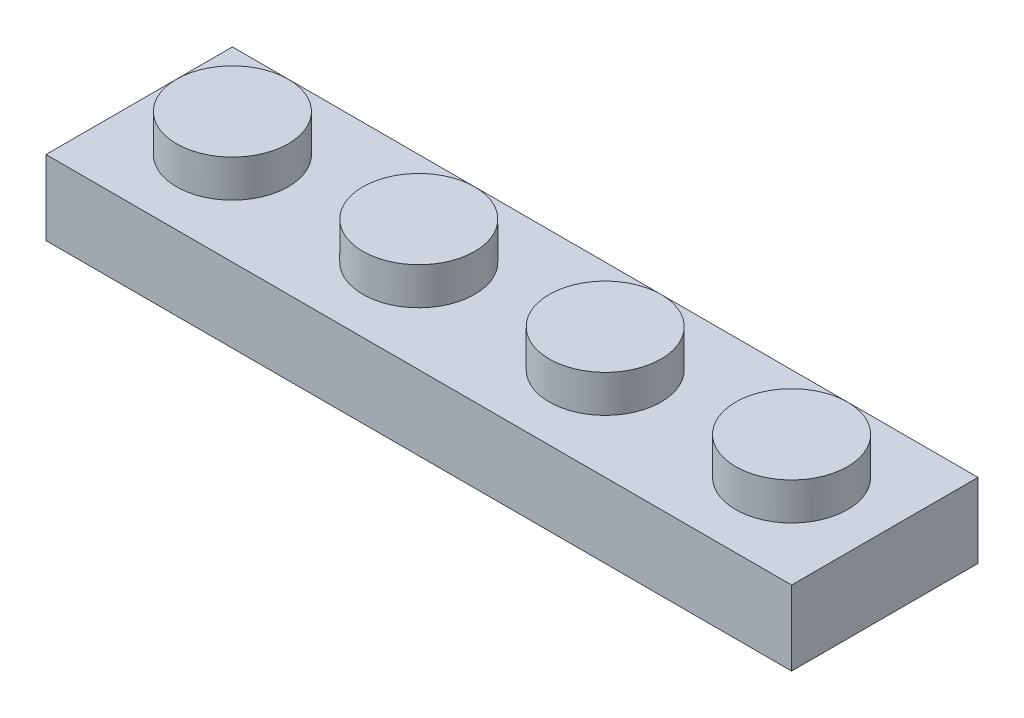
ISO-10303-21;
HEADER;
FILE_DESCRIPTION(('STEP AP214'),'2;1');
FILE_NAME('part.step','',(''),(''),'','','');
FILE_SCHEMA(('AUTOMOTIVE_DESIGN { 1 0 10303 214 1 1 1 1 }'));
ENDSEC;
DATA;
#1=APPLICATION_CONTEXT('core data for automotive mechanical design processes');
#2=APPLICATION_PROTOCOL_DEFINITION('international standard','automotive_design',2000,#1);
#3=PRODUCT_CONTEXT('',#1,'mechanical');
#4=PRODUCT('Part','Part','',(#3));
#5=PRODUCT_RELATED_PRODUCT_CATEGORY('part','',(#4));
#6=PRODUCT_DEFINITION_FORMATION('','',#4);
#7=PRODUCT_DEFINITION_CONTEXT('part definition',#1,'design');
#8=PRODUCT_DEFINITION('design','',#6,#7);
#9=PRODUCT_DEFINITION_SHAPE('','',#8);
#10=(LENGTH_UNIT() NAMED_UNIT(*) SI_UNIT(.MILLI.,.METRE.));
#11=(NAMED_UNIT(*) PLANE_ANGLE_UNIT() SI_UNIT($,.RADIAN.));
#12=(NAMED_UNIT(*) SI_UNIT($,.STERADIAN.) SOLID_ANGLE_UNIT());
#13=UNCERTAINTY_MEASURE_WITH_UNIT(LENGTH_MEASURE(1.E-05),#10,'distance_accuracy_value','');
#14=(GEOMETRIC_REPRESENTATION_CONTEXT(3) GLOBAL_UNCERTAINTY_ASSIGNED_CONTEXT((#13)) GLOBAL_UNIT_ASSIGNED_CONTEXT((#10,
#11,#12)) REPRESENTATION_CONTEXT('',''));
#15=CARTESIAN_POINT('',(0.,0.,0.));
#16=DIRECTION('',(0.,0.,1.));
#17=DIRECTION('',(1.,0.,0.));
#18=AXIS2_PLACEMENT_3D('',#15,#16,#17);
#19=CARTESIAN_POINT('',(0.,0.,0.));
#20=DIRECTION('',(0.,-1.,0.));
#21=DIRECTION('',(0.,0.,-1.));
#22=AXIS2_PLACEMENT_3D('',#19,#20,#21);
#23=PLANE('',#22);
#24=DIRECTION('',(0.,0.,1.));
#25=VECTOR('',#24,1.);
#26=CARTESIAN_POINT('',(0.,0.,0.));
#27=LINE('',#26,#25);
#28=CARTESIAN_POINT('',(0.,0.,-8.));
#29=VERTEX_POINT('',#28);
#30=CARTESIAN_POINT('',(0.,0.,0.));
#31=VERTEX_POINT('',#30);
#32=EDGE_CURVE('E192',#29,#31,#27,.T.);
#33=ORIENTED_EDGE('',*,*,#32,.F.);
#34=DIRECTION('',(-1.,0.,0.));
#35=VECTOR('',#34,1.);
#36=CARTESIAN_POINT('',(0.,0.,-8.));
#37=LINE('',#36,#35);
#38=CARTESIAN_POINT('',(32.,0.,-8.));
#39=VERTEX_POINT('',#38);
#40=EDGE_CURVE('E85',#39,#29,#37,.T.);
#41=ORIENTED_EDGE('',*,*,#40,.F.);
#42=DIRECTION('',(0.,0.,-1.));
#43=VECTOR('',#42,1.);
#44=CARTESIAN_POINT('',(32.,0.,0.));
#45=LINE('',#44,#43);
#46=CARTESIAN_POINT('',(32.,0.,0.));
#47=VERTEX_POINT('',#46);
#48=EDGE_CURVE('E210',#47,#39,#45,.T.);
#49=ORIENTED_EDGE('',*,*,#48,.F.);
#50=DIRECTION('',(1.,0.,0.));
#51=VECTOR('',#50,1.);
#52=CARTESIAN_POINT('',(0.,0.,0.));
#53=LINE('',#52,#51);
#54=EDGE_CURVE('E207',#31,#47,#53,.T.);
#55=ORIENTED_EDGE('',*,*,#54,.F.);
#56=EDGE_LOOP('',(#33,#41,#49,#55));
#57=FACE_BOUND('',#56,.T.);
#58=DIRECTION('',(-1.,0.,0.));
#59=VECTOR('',#58,1.);
#60=CARTESIAN_POINT('',(0.,0.,-6.4));
#61=LINE('',#60,#59);
#62=CARTESIAN_POINT('',(30.4,0.,-6.4));
#63=VERTEX_POINT('',#62);
#64=CARTESIAN_POINT('',(1.6,0.,-6.4));
#65=VERTEX_POINT('',#64);
#66=EDGE_CURVE('E175',#63,#65,#61,.T.);
#67=ORIENTED_EDGE('',*,*,#66,.T.);
#68=DIRECTION('',(0.,0.,1.));
#69=VECTOR('',#68,1.);
#70=CARTESIAN_POINT('',(1.6,0.,0.));
#71=LINE('',#70,#69);
#72=CARTESIAN_POINT('',(1.6,0.,-1.6));
#73=VERTEX_POINT('',#72);
#74=EDGE_CURVE('E166',#65,#73,#71,.T.);
#75=ORIENTED_EDGE('',*,*,#74,.T.);
#76=DIRECTION('',(1.,0.,0.));
#77=VECTOR('',#76,1.);
#78=CARTESIAN_POINT('',(0.,0.,-1.6));
#79=LINE('',#78,#77);
#80=CARTESIAN_POINT('',(30.4,0.,-1.6));
#81=VERTEX_POINT('',#80);
#82=EDGE_CURVE('E174',#73,#81,#79,.T.);
#83=ORIENTED_EDGE('',*,*,#82,.T.);
#84=DIRECTION('',(0.,0.,-1.));
#85=VECTOR('',#84,1.);
#86=CARTESIAN_POINT('',(30.4,0.,0.));
#87=LINE('',#86,#85);
#88=EDGE_CURVE('E55',#81,#63,#87,.T.);
#89=ORIENTED_EDGE('',*,*,#88,.T.);
#90=EDGE_LOOP('',(#67,#75,#83,#89));
#91=FACE_BOUND('',#90,.T.);
#92=ADVANCED_FACE('F39',(#57,#91),#23,.T.);
#93=CARTESIAN_POINT('',(4.,4.8,-4.));
#94=DIRECTION('',(0.,1.,0.));
#95=DIRECTION('',(0.,0.,1.));
#96=AXIS2_PLACEMENT_3D('',#93,#94,#95);
#97=PLANE('',#96);
#98=CARTESIAN_POINT('',(4.,4.8,-4.));
#99=DIRECTION('',(0.,1.,0.));
#100=DIRECTION('',(0.,0.,1.));
#101=AXIS2_PLACEMENT_3D('',#98,#99,#100);
#102=CIRCLE('',#101,2.4);
#103=CARTESIAN_POINT('',(4.,4.8,-1.6));
#104=VERTEX_POINT('',#103);
#105=EDGE_CURVE('E11',#104,#104,#102,.T.);
#106=ORIENTED_EDGE('',*,*,#105,.T.);
#107=EDGE_LOOP('',(#106));
#108=FACE_BOUND('',#107,.T.);
#109=ADVANCED_FACE('F41',(#108),#97,.T.);
#110=CARTESIAN_POINT('',(4.,4.8,-4.));
#111=DIRECTION('',(0.,-1.,0.));
#112=DIRECTION('',(0.,0.,-1.));
#113=AXIS2_PLACEMENT_3D('',#110,#111,#112);
#114=CYLINDRICAL_SURFACE('',#113,2.4);
#115=ORIENTED_EDGE('',*,*,#105,.F.);
#116=EDGE_LOOP('',(#115));
#117=FACE_BOUND('',#116,.T.);
#118=CARTESIAN_POINT('',(4.,3.2,-4.));
#119=DIRECTION('',(0.,-1.,0.));
#120=DIRECTION('',(0.,0.,-1.));
#121=AXIS2_PLACEMENT_3D('',#118,#119,#120);
#122=CIRCLE('',#121,2.4);
#123=CARTESIAN_POINT('',(4.,3.2,-6.4));
#124=VERTEX_POINT('',#123);
#125=EDGE_CURVE('E48',#124,#124,#122,.F.);
#126=ORIENTED_EDGE('',*,*,#125,.T.);
#127=EDGE_LOOP('',(#126));
#128=FACE_BOUND('',#127,.T.);
#129=ADVANCED_FACE('F246',(#117,#128),#114,.T.);
#130=CARTESIAN_POINT('',(12.,4.8,-4.));
#131=DIRECTION('',(0.,1.,0.));
#132=DIRECTION('',(0.,0.,1.));
#133=AXIS2_PLACEMENT_3D('',#130,#131,#132);
#134=PLANE('',#133);
#135=CARTESIAN_POINT('',(12.,4.8,-4.));
#136=DIRECTION('',(0.,1.,0.));
#137=DIRECTION('',(0.,0.,1.));
#138=AXIS2_PLACEMENT_3D('',#135,#136,#137);
#139=CIRCLE('',#138,2.4);
#140=CARTESIAN_POINT('',(12.,4.8,-1.6));
#141=VERTEX_POINT('',#140);
#142=EDGE_CURVE('E239',#141,#141,#139,.T.);
#143=ORIENTED_EDGE('',*,*,#142,.T.);
#144=EDGE_LOOP('',(#143));
#145=FACE_BOUND('',#144,.T.);
#146=ADVANCED_FACE('F288',(#145),#134,.T.);
#147=CARTESIAN_POINT('',(12.,4.8,-4.));
#148=DIRECTION('',(0.,-1.,0.));
#149=DIRECTION('',(0.,0.,-1.));
#150=AXIS2_PLACEMENT_3D('',#147,#148,#149);
#151=CYLINDRICAL_SURFACE('',#150,2.4);
#152=ORIENTED_EDGE('',*,*,#142,.F.);
#153=EDGE_LOOP('',(#152));
#154=FACE_BOUND('',#153,.T.);
#155=CARTESIAN_POINT('',(12.,3.2,-4.));
#156=DIRECTION('',(0.,-1.,0.));
#157=DIRECTION('',(0.,0.,-1.));
#158=AXIS2_PLACEMENT_3D('',#155,#156,#157);
#159=CIRCLE('',#158,2.4);
#160=CARTESIAN_POINT('',(12.,3.2,-6.4));
#161=VERTEX_POINT('',#160);
#162=EDGE_CURVE('E235',#161,#161,#159,.F.);
#163=ORIENTED_EDGE('',*,*,#162,.T.);
#164=EDGE_LOOP('',(#163));
#165=FACE_BOUND('',#164,.T.);
#166=ADVANCED_FACE('F284',(#154,#165),#151,.T.);
#167=CARTESIAN_POINT('',(0.,3.2,0.));
#168=DIRECTION('',(1.,0.,0.));
#169=DIRECTION('',(0.,0.,-1.));
#170=AXIS2_PLACEMENT_3D('',#167,#168,#169);
#171=PLANE('',#170);
#172=ORIENTED_EDGE('',*,*,#32,.T.);
#173=DIRECTION('',(0.,-1.,0.));
#174=VECTOR('',#173,1.);
#175=CARTESIAN_POINT('',(0.,3.2,0.));
#176=LINE('',#175,#174);
#177=CARTESIAN_POINT('',(0.,3.2,0.));
#178=VERTEX_POINT('',#177);
#179=EDGE_CURVE('E224',#178,#31,#176,.T.);
#180=ORIENTED_EDGE('',*,*,#179,.F.);
#181=DIRECTION('',(0.,0.,1.));
#182=VECTOR('',#181,1.);
#183=CARTESIAN_POINT('',(0.,3.2,0.));
#184=LINE('',#183,#182);
#185=CARTESIAN_POINT('',(0.,3.2,-8.));
#186=VERTEX_POINT('',#185);
#187=EDGE_CURVE('E193',#186,#178,#184,.T.);
#188=ORIENTED_EDGE('',*,*,#187,.F.);
#189=DIRECTION('',(0.,-1.,0.));
#190=VECTOR('',#189,1.);
#191=CARTESIAN_POINT('',(0.,3.2,-8.));
#192=LINE('',#191,#190);
#193=EDGE_CURVE('E203',#186,#29,#192,.T.);
#194=ORIENTED_EDGE('',*,*,#193,.T.);
#195=EDGE_LOOP('',(#172,#180,#188,#194));
#196=FACE_BOUND('',#195,.T.);
#197=ADVANCED_FACE('F281',(#196),#171,.F.);
#198=CARTESIAN_POINT('',(0.,3.2,0.));
#199=DIRECTION('',(0.,0.,-1.));
#200=DIRECTION('',(-1.,0.,0.));
#201=AXIS2_PLACEMENT_3D('',#198,#199,#200);
#202=PLANE('',#201);
#203=ORIENTED_EDGE('',*,*,#54,.T.);
#204=DIRECTION('',(0.,-1.,0.));
#205=VECTOR('',#204,1.);
#206=CARTESIAN_POINT('',(32.,3.2,0.));
#207=LINE('',#206,#205);
#208=CARTESIAN_POINT('',(32.,3.2,0.));
#209=VERTEX_POINT('',#208);
#210=EDGE_CURVE('E220',#209,#47,#207,.T.);
#211=ORIENTED_EDGE('',*,*,#210,.F.);
#212=DIRECTION('',(1.,0.,0.));
#213=VECTOR('',#212,1.);
#214=CARTESIAN_POINT('',(0.,3.2,0.));
#215=LINE('',#214,#213);
#216=EDGE_CURVE('E93',#178,#209,#215,.T.);
#217=ORIENTED_EDGE('',*,*,#216,.F.);
#218=ORIENTED_EDGE('',*,*,#179,.T.);
#219=EDGE_LOOP('',(#203,#211,#217,#218));
#220=FACE_BOUND('',#219,.T.);
#221=ADVANCED_FACE('F277',(#220),#202,.F.);
#222=CARTESIAN_POINT('',(32.,3.2,0.));
#223=DIRECTION('',(-1.,0.,0.));
#224=DIRECTION('',(0.,0.,1.));
#225=AXIS2_PLACEMENT_3D('',#222,#223,#224);
#226=PLANE('',#225);
#227=ORIENTED_EDGE('',*,*,#48,.T.);
#228=DIRECTION('',(0.,-1.,0.));
#229=VECTOR('',#228,1.);
#230=CARTESIAN_POINT('',(32.,3.2,-8.));
#231=LINE('',#230,#229);
#232=CARTESIAN_POINT('',(32.,3.2,-8.));
#233=VERTEX_POINT('',#232);
#234=EDGE_CURVE('E217',#233,#39,#231,.T.);
#235=ORIENTED_EDGE('',*,*,#234,.F.);
#236=DIRECTION('',(0.,0.,-1.));
#237=VECTOR('',#236,1.);
#238=CARTESIAN_POINT('',(32.,3.2,0.));
#239=LINE('',#238,#237);
#240=EDGE_CURVE('E198',#209,#233,#239,.T.);
#241=ORIENTED_EDGE('',*,*,#240,.F.);
#242=ORIENTED_EDGE('',*,*,#210,.T.);
#243=EDGE_LOOP('',(#227,#235,#241,#242));
#244=FACE_BOUND('',#243,.T.);
#245=ADVANCED_FACE('F261',(#244),#226,.F.);
#246=CARTESIAN_POINT('',(0.,3.2,-8.));
#247=DIRECTION('',(0.,0.,1.));
#248=DIRECTION('',(1.,0.,0.));
#249=AXIS2_PLACEMENT_3D('',#246,#247,#248);
#250=PLANE('',#249);
#251=ORIENTED_EDGE('',*,*,#40,.T.);
#252=ORIENTED_EDGE('',*,*,#193,.F.);
#253=DIRECTION('',(-1.,0.,0.));
#254=VECTOR('',#253,1.);
#255=CARTESIAN_POINT('',(0.,3.2,-8.));
#256=LINE('',#255,#254);
#257=EDGE_CURVE('E64',#233,#186,#256,.T.);
#258=ORIENTED_EDGE('',*,*,#257,.F.);
#259=ORIENTED_EDGE('',*,*,#234,.T.);
#260=EDGE_LOOP('',(#251,#252,#258,#259));
#261=FACE_BOUND('',#260,.T.);
#262=ADVANCED_FACE('F251',(#261),#250,.F.);
#263=CARTESIAN_POINT('',(0.,3.2,0.));
#264=DIRECTION('',(0.,-1.,0.));
#265=DIRECTION('',(0.,0.,-1.));
#266=AXIS2_PLACEMENT_3D('',#263,#264,#265);
#267=PLANE('',#266);
#268=CARTESIAN_POINT('',(20.,3.2,-4.));
#269=DIRECTION('',(0.,-1.,0.));
#270=DIRECTION('',(0.,0.,-1.));
#271=AXIS2_PLACEMENT_3D('',#268,#269,#270);
#272=CIRCLE('',#271,2.4);
#273=CARTESIAN_POINT('',(20.,3.2,-6.4));
#274=VERTEX_POINT('',#273);
#275=EDGE_CURVE('E231',#274,#274,#272,.F.);
#276=ORIENTED_EDGE('',*,*,#275,.F.);
#277=EDGE_LOOP('',(#276));
#278=FACE_BOUND('',#277,.T.);
#279=CARTESIAN_POINT('',(28.,3.2,-4.));
#280=DIRECTION('',(0.,-1.,0.));
#281=DIRECTION('',(0.,0.,-1.));
#282=AXIS2_PLACEMENT_3D('',#279,#280,#281);
#283=CIRCLE('',#282,2.4);
#284=CARTESIAN_POINT('',(28.,3.2,-6.4));
#285=VERTEX_POINT('',#284);
#286=EDGE_CURVE('E227',#285,#285,#283,.F.);
#287=ORIENTED_EDGE('',*,*,#286,.F.);
#288=EDGE_LOOP('',(#287));
#289=FACE_BOUND('',#288,.T.);
#290=ORIENTED_EDGE('',*,*,#187,.T.);
#291=ORIENTED_EDGE('',*,*,#216,.T.);
#292=ORIENTED_EDGE('',*,*,#240,.T.);
#293=ORIENTED_EDGE('',*,*,#257,.T.);
#294=EDGE_LOOP('',(#290,#291,#292,#293));
#295=FACE_BOUND('',#294,.T.);
#296=ORIENTED_EDGE('',*,*,#162,.F.);
#297=EDGE_LOOP('',(#296));
#298=FACE_BOUND('',#297,.T.);
#299=ORIENTED_EDGE('',*,*,#125,.F.);
#300=EDGE_LOOP('',(#299));
#301=FACE_BOUND('',#300,.T.);
#302=ADVANCED_FACE('F248',(#278,#289,#295,#298,#301),#267,.F.);
#303=CARTESIAN_POINT('',(28.,4.8,-4.));
#304=DIRECTION('',(0.,-1.,0.));
#305=DIRECTION('',(0.,0.,-1.));
#306=AXIS2_PLACEMENT_3D('',#303,#304,#305);
#307=CYLINDRICAL_SURFACE('',#306,2.4);
#308=CARTESIAN_POINT('',(28.,4.8,-4.));
#309=DIRECTION('',(0.,1.,0.));
#310=DIRECTION('',(0.,0.,1.));
#311=AXIS2_PLACEMENT_3D('',#308,#309,#310);
#312=CIRCLE('',#311,2.4);
#313=CARTESIAN_POINT('',(28.,4.8,-1.6));
#314=VERTEX_POINT('',#313);
#315=EDGE_CURVE('E187',#314,#314,#312,.T.);
#316=ORIENTED_EDGE('',*,*,#315,.F.);
#317=EDGE_LOOP('',(#316));
#318=FACE_BOUND('',#317,.T.);
#319=ORIENTED_EDGE('',*,*,#286,.T.);
#320=EDGE_LOOP('',(#319));
#321=FACE_BOUND('',#320,.T.);
#322=ADVANCED_FACE('F250',(#318,#321),#307,.T.);
#323=CARTESIAN_POINT('',(28.,4.8,-4.));
#324=DIRECTION('',(0.,1.,0.));
#325=DIRECTION('',(0.,0.,1.));
#326=AXIS2_PLACEMENT_3D('',#323,#324,#325);
#327=PLANE('',#326);
#328=ORIENTED_EDGE('',*,*,#315,.T.);
#329=EDGE_LOOP('',(#328));
#330=FACE_BOUND('',#329,.T.);
#331=ADVANCED_FACE('F258',(#330),#327,.T.);
#332=CARTESIAN_POINT('',(20.,4.8,-4.));
#333=DIRECTION('',(0.,-1.,0.));
#334=DIRECTION('',(0.,0.,-1.));
#335=AXIS2_PLACEMENT_3D('',#332,#333,#334);
#336=CYLINDRICAL_SURFACE('',#335,2.4);
#337=CARTESIAN_POINT('',(20.,4.8,-4.));
#338=DIRECTION('',(0.,1.,0.));
#339=DIRECTION('',(0.,0.,1.));
#340=AXIS2_PLACEMENT_3D('',#337,#338,#339);
#341=CIRCLE('',#340,2.4);
#342=CARTESIAN_POINT('',(20.,4.8,-1.6));
#343=VERTEX_POINT('',#342);
#344=EDGE_CURVE('E183',#343,#343,#341,.T.);
#345=ORIENTED_EDGE('',*,*,#344,.F.);
#346=EDGE_LOOP('',(#345));
#347=FACE_BOUND('',#346,.T.);
#348=ORIENTED_EDGE('',*,*,#275,.T.);
#349=EDGE_LOOP('',(#348));
#350=FACE_BOUND('',#349,.T.);
#351=ADVANCED_FACE('F338',(#347,#350),#336,.T.);
#352=CARTESIAN_POINT('',(20.,4.8,-4.));
#353=DIRECTION('',(0.,1.,0.));
#354=DIRECTION('',(0.,0.,1.));
#355=AXIS2_PLACEMENT_3D('',#352,#353,#354);
#356=PLANE('',#355);
#357=ORIENTED_EDGE('',*,*,#344,.T.);
#358=EDGE_LOOP('',(#357));
#359=FACE_BOUND('',#358,.T.);
#360=ADVANCED_FACE('F360',(#359),#356,.T.);
#361=CARTESIAN_POINT('',(4.,3.2,-4.));
#362=DIRECTION('',(0.,1.,0.));
#363=DIRECTION('',(0.,0.,1.));
#364=AXIS2_PLACEMENT_3D('',#361,#362,#363);
#365=PLANE('',#364);
#366=CARTESIAN_POINT('',(4.,3.2,-4.));
#367=DIRECTION('',(0.,1.,0.));
#368=DIRECTION('',(0.,0.,1.));
#369=AXIS2_PLACEMENT_3D('',#366,#367,#368);
#370=CIRCLE('',#369,0.800000000000001);
#371=CARTESIAN_POINT('',(4.,3.2,-3.2));
#372=VERTEX_POINT('',#371);
#373=EDGE_CURVE('E188',#372,#372,#370,.T.);
#374=ORIENTED_EDGE('',*,*,#373,.F.);
#375=EDGE_LOOP('',(#374));
#376=FACE_BOUND('',#375,.T.);
#377=ADVANCED_FACE('F369',(#376),#365,.F.);
#378=CARTESIAN_POINT('',(4.,4.8,-4.));
#379=DIRECTION('',(0.,-1.,0.));
#380=DIRECTION('',(0.,0.,-1.));
#381=AXIS2_PLACEMENT_3D('',#378,#379,#380);
#382=CYLINDRICAL_SURFACE('',#381,0.800000000000001);
#383=ORIENTED_EDGE('',*,*,#373,.T.);
#384=EDGE_LOOP('',(#383));
#385=FACE_BOUND('',#384,.T.);
#386=CARTESIAN_POINT('',(4.,1.6,-4.));
#387=DIRECTION('',(0.,-1.,0.));
#388=DIRECTION('',(0.,0.,-1.));
#389=AXIS2_PLACEMENT_3D('',#386,#387,#388);
#390=CIRCLE('',#389,0.800000000000001);
#391=CARTESIAN_POINT('',(4.,1.6,-4.8));
#392=VERTEX_POINT('',#391);
#393=EDGE_CURVE('E154',#392,#392,#390,.F.);
#394=ORIENTED_EDGE('',*,*,#393,.F.);
#395=EDGE_LOOP('',(#394));
#396=FACE_BOUND('',#395,.T.);
#397=ADVANCED_FACE('F382',(#385,#396),#382,.F.);
#398=CARTESIAN_POINT('',(12.,3.2,-4.));
#399=DIRECTION('',(0.,1.,0.));
#400=DIRECTION('',(0.,0.,1.));
#401=AXIS2_PLACEMENT_3D('',#398,#399,#400);
#402=PLANE('',#401);
#403=CARTESIAN_POINT('',(12.,3.2,-4.));
#404=DIRECTION('',(0.,1.,0.));
#405=DIRECTION('',(0.,0.,1.));
#406=AXIS2_PLACEMENT_3D('',#403,#404,#405);
#407=CIRCLE('',#406,0.800000000000001);
#408=CARTESIAN_POINT('',(12.,3.2,-3.2));
#409=VERTEX_POINT('',#408);
#410=EDGE_CURVE('E149',#409,#409,#407,.T.);
#411=ORIENTED_EDGE('',*,*,#410,.F.);
#412=EDGE_LOOP('',(#411));
#413=FACE_BOUND('',#412,.T.);
#414=ADVANCED_FACE('F391',(#413),#402,.F.);
#415=CARTESIAN_POINT('',(12.,4.8,-4.));
#416=DIRECTION('',(0.,-1.,0.));
#417=DIRECTION('',(0.,0.,-1.));
#418=AXIS2_PLACEMENT_3D('',#415,#416,#417);
#419=CYLINDRICAL_SURFACE('',#418,0.800000000000001);
#420=ORIENTED_EDGE('',*,*,#410,.T.);
#421=EDGE_LOOP('',(#420));
#422=FACE_BOUND('',#421,.T.);
#423=CARTESIAN_POINT('',(12.,1.6,-4.));
#424=DIRECTION('',(0.,-1.,0.));
#425=DIRECTION('',(0.,0.,-1.));
#426=AXIS2_PLACEMENT_3D('',#423,#424,#425);
#427=CIRCLE('',#426,0.800000000000001);
#428=CARTESIAN_POINT('',(12.,1.6,-4.8));
#429=VERTEX_POINT('',#428);
#430=EDGE_CURVE('E145',#429,#429,#427,.F.);
#431=ORIENTED_EDGE('',*,*,#430,.F.);
#432=EDGE_LOOP('',(#431));
#433=FACE_BOUND('',#432,.T.);
#434=ADVANCED_FACE('F400',(#422,#433),#419,.F.);
#435=CARTESIAN_POINT('',(1.6,3.2,0.));
#436=DIRECTION('',(1.,0.,0.));
#437=DIRECTION('',(0.,0.,-1.));
#438=AXIS2_PLACEMENT_3D('',#435,#436,#437);
#439=PLANE('',#438);
#440=ORIENTED_EDGE('',*,*,#74,.F.);
#441=DIRECTION('',(0.,-1.,0.));
#442=VECTOR('',#441,1.);
#443=CARTESIAN_POINT('',(1.6,3.2,-6.4));
#444=LINE('',#443,#442);
#445=CARTESIAN_POINT('',(1.6,1.6,-6.4));
#446=VERTEX_POINT('',#445);
#447=EDGE_CURVE('E141',#446,#65,#444,.T.);
#448=ORIENTED_EDGE('',*,*,#447,.F.);
#449=DIRECTION('',(0.,0.,1.));
#450=VECTOR('',#449,1.);
#451=CARTESIAN_POINT('',(1.6,1.6,0.));
#452=LINE('',#451,#450);
#453=CARTESIAN_POINT('',(1.6,1.6,-1.6));
#454=VERTEX_POINT('',#453);
#455=EDGE_CURVE('E127',#446,#454,#452,.T.);
#456=ORIENTED_EDGE('',*,*,#455,.T.);
#457=DIRECTION('',(0.,-1.,0.));
#458=VECTOR('',#457,1.);
#459=CARTESIAN_POINT('',(1.6,3.2,-1.6));
#460=LINE('',#459,#458);
#461=EDGE_CURVE('E120',#454,#73,#460,.T.);
#462=ORIENTED_EDGE('',*,*,#461,.T.);
#463=EDGE_LOOP('',(#440,#448,#456,#462));
#464=FACE_BOUND('',#463,.T.);
#465=ADVANCED_FACE('F409',(#464),#439,.T.);
#466=CARTESIAN_POINT('',(0.,3.2,-1.6));
#467=DIRECTION('',(0.,0.,-1.));
#468=DIRECTION('',(-1.,0.,0.));
#469=AXIS2_PLACEMENT_3D('',#466,#467,#468);
#470=PLANE('',#469);
#471=ORIENTED_EDGE('',*,*,#82,.F.);
#472=ORIENTED_EDGE('',*,*,#461,.F.);
#473=DIRECTION('',(1.,0.,0.));
#474=VECTOR('',#473,1.);
#475=CARTESIAN_POINT('',(0.,1.6,-1.6));
#476=LINE('',#475,#474);
#477=CARTESIAN_POINT('',(30.4,1.6,-1.6));
#478=VERTEX_POINT('',#477);
#479=EDGE_CURVE('E115',#454,#478,#476,.T.);
#480=ORIENTED_EDGE('',*,*,#479,.T.);
#481=DIRECTION('',(0.,-1.,0.));
#482=VECTOR('',#481,1.);
#483=CARTESIAN_POINT('',(30.4,3.2,-1.6));
#484=LINE('',#483,#482);
#485=EDGE_CURVE('E117',#478,#81,#484,.T.);
#486=ORIENTED_EDGE('',*,*,#485,.T.);
#487=EDGE_LOOP('',(#471,#472,#480,#486));
#488=FACE_BOUND('',#487,.T.);
#489=ADVANCED_FACE('F116',(#488),#470,.T.);
#490=CARTESIAN_POINT('',(30.4,3.2,0.));
#491=DIRECTION('',(-1.,0.,0.));
#492=DIRECTION('',(0.,0.,1.));
#493=AXIS2_PLACEMENT_3D('',#490,#491,#492);
#494=PLANE('',#493);
#495=ORIENTED_EDGE('',*,*,#88,.F.);
#496=ORIENTED_EDGE('',*,*,#485,.F.);
#497=DIRECTION('',(0.,0.,-1.));
#498=VECTOR('',#497,1.);
#499=CARTESIAN_POINT('',(30.4,1.6,0.));
#500=LINE('',#499,#498);
#501=CARTESIAN_POINT('',(30.4,1.6,-6.4));
#502=VERTEX_POINT('',#501);
#503=EDGE_CURVE('E126',#478,#502,#500,.T.);
#504=ORIENTED_EDGE('',*,*,#503,.T.);
#505=DIRECTION('',(0.,-1.,0.));
#506=VECTOR('',#505,1.);
#507=CARTESIAN_POINT('',(30.4,3.2,-6.4));
#508=LINE('',#507,#506);
#509=EDGE_CURVE('E132',#502,#63,#508,.T.);
#510=ORIENTED_EDGE('',*,*,#509,.T.);
#511=EDGE_LOOP('',(#495,#496,#504,#510));
#512=FACE_BOUND('',#511,.T.);
#513=ADVANCED_FACE('F129',(#512),#494,.T.);
#514=CARTESIAN_POINT('',(0.,3.2,-6.4));
#515=DIRECTION('',(0.,0.,1.));
#516=DIRECTION('',(1.,0.,0.));
#517=AXIS2_PLACEMENT_3D('',#514,#515,#516);
#518=PLANE('',#517);
#519=ORIENTED_EDGE('',*,*,#66,.F.);
#520=ORIENTED_EDGE('',*,*,#509,.F.);
#521=DIRECTION('',(-1.,0.,0.));
#522=VECTOR('',#521,1.);
#523=CARTESIAN_POINT('',(0.,1.6,-6.4));
#524=LINE('',#523,#522);
#525=EDGE_CURVE('E137',#502,#446,#524,.T.);
#526=ORIENTED_EDGE('',*,*,#525,.T.);
#527=ORIENTED_EDGE('',*,*,#447,.T.);
#528=EDGE_LOOP('',(#519,#520,#526,#527));
#529=FACE_BOUND('',#528,.T.);
#530=ADVANCED_FACE('F433',(#529),#518,.T.);
#531=CARTESIAN_POINT('',(0.,1.6,0.));
#532=DIRECTION('',(0.,-1.,0.));
#533=DIRECTION('',(0.,0.,-1.));
#534=AXIS2_PLACEMENT_3D('',#531,#532,#533);
#535=PLANE('',#534);
#536=CARTESIAN_POINT('',(20.,1.6,-4.));
#537=DIRECTION('',(0.,-1.,0.));
#538=DIRECTION('',(0.,0.,-1.));
#539=AXIS2_PLACEMENT_3D('',#536,#537,#538);
#540=CIRCLE('',#539,0.800000000000001);
#541=CARTESIAN_POINT('',(20.,1.6,-4.8));
#542=VERTEX_POINT('',#541);
#543=EDGE_CURVE('E150',#542,#542,#540,.F.);
#544=ORIENTED_EDGE('',*,*,#543,.T.);
#545=EDGE_LOOP('',(#544));
#546=FACE_BOUND('',#545,.T.);
#547=CARTESIAN_POINT('',(28.,1.6,-4.));
#548=DIRECTION('',(0.,-1.,0.));
#549=DIRECTION('',(0.,0.,-1.));
#550=AXIS2_PLACEMENT_3D('',#547,#548,#549);
#551=CIRCLE('',#550,0.800000000000001);
#552=CARTESIAN_POINT('',(28.,1.6,-4.8));
#553=VERTEX_POINT('',#552);
#554=EDGE_CURVE('E157',#553,#553,#551,.F.);
#555=ORIENTED_EDGE('',*,*,#554,.T.);
#556=EDGE_LOOP('',(#555));
#557=FACE_BOUND('',#556,.T.);
#558=ORIENTED_EDGE('',*,*,#455,.F.);
#559=ORIENTED_EDGE('',*,*,#525,.F.);
#560=ORIENTED_EDGE('',*,*,#503,.F.);
#561=ORIENTED_EDGE('',*,*,#479,.F.);
#562=EDGE_LOOP('',(#558,#559,#560,#561));
#563=FACE_BOUND('',#562,.T.);
#564=ORIENTED_EDGE('',*,*,#430,.T.);
#565=EDGE_LOOP('',(#564));
#566=FACE_BOUND('',#565,.T.);
#567=ORIENTED_EDGE('',*,*,#393,.T.);
#568=EDGE_LOOP('',(#567));
#569=FACE_BOUND('',#568,.T.);
#570=ADVANCED_FACE('F135',(#546,#557,#563,#566,#569),#535,.T.);
#571=CARTESIAN_POINT('',(28.,4.8,-4.));
#572=DIRECTION('',(0.,-1.,0.));
#573=DIRECTION('',(0.,0.,-1.));
#574=AXIS2_PLACEMENT_3D('',#571,#572,#573);
#575=CYLINDRICAL_SURFACE('',#574,0.800000000000001);
#576=CARTESIAN_POINT('',(28.,3.2,-4.));
#577=DIRECTION('',(0.,1.,0.));
#578=DIRECTION('',(0.,0.,1.));
#579=AXIS2_PLACEMENT_3D('',#576,#577,#578);
#580=CIRCLE('',#579,0.800000000000001);
#581=CARTESIAN_POINT('',(28.,3.2,-3.2));
#582=VERTEX_POINT('',#581);
#583=EDGE_CURVE('E162',#582,#582,#580,.T.);
#584=ORIENTED_EDGE('',*,*,#583,.T.);
#585=EDGE_LOOP('',(#584));
#586=FACE_BOUND('',#585,.T.);
#587=ORIENTED_EDGE('',*,*,#554,.F.);
#588=EDGE_LOOP('',(#587));
#589=FACE_BOUND('',#588,.T.);
#590=ADVANCED_FACE('F449',(#586,#589),#575,.F.);
#591=CARTESIAN_POINT('',(28.,3.2,-4.));
#592=DIRECTION('',(0.,1.,0.));
#593=DIRECTION('',(0.,0.,1.));
#594=AXIS2_PLACEMENT_3D('',#591,#592,#593);
#595=PLANE('',#594);
#596=ORIENTED_EDGE('',*,*,#583,.F.);
#597=EDGE_LOOP('',(#596));
#598=FACE_BOUND('',#597,.T.);
#599=ADVANCED_FACE('F458',(#598),#595,.F.);
#600=CARTESIAN_POINT('',(20.,4.8,-4.));
#601=DIRECTION('',(0.,-1.,0.));
#602=DIRECTION('',(0.,0.,-1.));
#603=AXIS2_PLACEMENT_3D('',#600,#601,#602);
#604=CYLINDRICAL_SURFACE('',#603,0.800000000000001);
#605=CARTESIAN_POINT('',(20.,3.2,-4.));
#606=DIRECTION('',(0.,1.,0.));
#607=DIRECTION('',(0.,0.,1.));
#608=AXIS2_PLACEMENT_3D('',#605,#606,#607);
#609=CIRCLE('',#608,0.800000000000001);
#610=CARTESIAN_POINT('',(20.,3.2,-3.2));
#611=VERTEX_POINT('',#610);
#612=EDGE_CURVE('E167',#611,#611,#609,.T.);
#613=ORIENTED_EDGE('',*,*,#612,.T.);
#614=EDGE_LOOP('',(#613));
#615=FACE_BOUND('',#614,.T.);
#616=ORIENTED_EDGE('',*,*,#543,.F.);
#617=EDGE_LOOP('',(#616));
#618=FACE_BOUND('',#617,.T.);
#619=ADVANCED_FACE('F467',(#615,#618),#604,.F.);
#620=CARTESIAN_POINT('',(20.,3.2,-4.));
#621=DIRECTION('',(0.,1.,0.));
#622=DIRECTION('',(0.,0.,1.));
#623=AXIS2_PLACEMENT_3D('',#620,#621,#622);
#624=PLANE('',#623);
#625=ORIENTED_EDGE('',*,*,#612,.F.);
#626=EDGE_LOOP('',(#625));
#627=FACE_BOUND('',#626,.T.);
#628=ADVANCED_FACE('F476',(#627),#624,.F.);
#629=CLOSED_SHELL('',(#92,#109,#129,#146,#166,#197,#221,#245,#262,#302,#322,#331,#351,#360,#377,
#397,#414,#434,#465,#489,#513,#530,#570,#590,#599,#619,#628));
#630=MANIFOLD_SOLID_BREP('B2',#629);
#631=ADVANCED_BREP_SHAPE_REPRESENTATION('',(#18,#630),#14);
#632=SHAPE_DEFINITION_REPRESENTATION(#9,#631);
ENDSEC;
END-ISO-10303-21;
